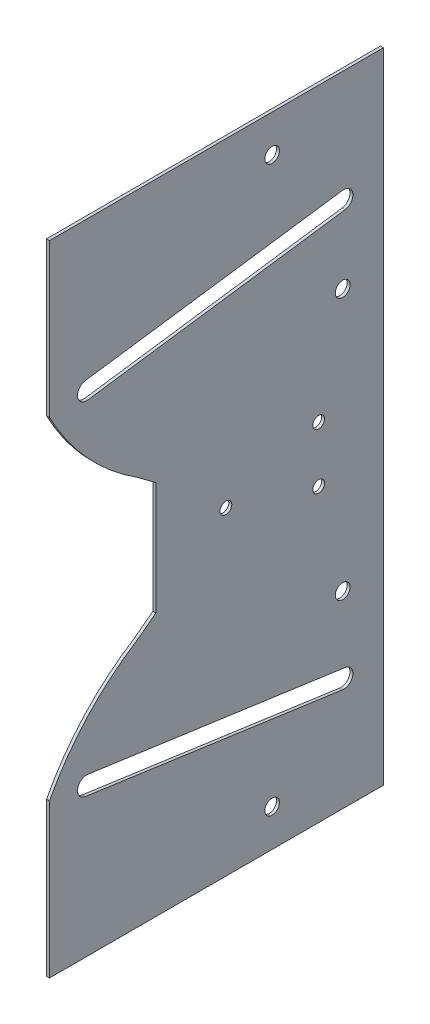
ISO-10303-21;
HEADER;
FILE_DESCRIPTION(('STEP AP214'),'2;1');
FILE_NAME('part.step','',(''),(''),'','','');
FILE_SCHEMA(('AUTOMOTIVE_DESIGN { 1 0 10303 214 1 1 1 1 }'));
ENDSEC;
DATA;
#1=APPLICATION_CONTEXT('core data for automotive mechanical design processes');
#2=APPLICATION_PROTOCOL_DEFINITION('international standard','automotive_design',2000,#1);
#3=PRODUCT_CONTEXT('',#1,'mechanical');
#4=PRODUCT('Part','Part','',(#3));
#5=PRODUCT_RELATED_PRODUCT_CATEGORY('part','',(#4));
#6=PRODUCT_DEFINITION_FORMATION('','',#4);
#7=PRODUCT_DEFINITION_CONTEXT('part definition',#1,'design');
#8=PRODUCT_DEFINITION('design','',#6,#7);
#9=PRODUCT_DEFINITION_SHAPE('','',#8);
#10=(LENGTH_UNIT() NAMED_UNIT(*) SI_UNIT(.MILLI.,.METRE.));
#11=(NAMED_UNIT(*) PLANE_ANGLE_UNIT() SI_UNIT($,.RADIAN.));
#12=(NAMED_UNIT(*) SI_UNIT($,.STERADIAN.) SOLID_ANGLE_UNIT());
#13=UNCERTAINTY_MEASURE_WITH_UNIT(LENGTH_MEASURE(1.E-05),#10,'distance_accuracy_value','');
#14=(GEOMETRIC_REPRESENTATION_CONTEXT(3) GLOBAL_UNCERTAINTY_ASSIGNED_CONTEXT((#13)) GLOBAL_UNIT_ASSIGNED_CONTEXT((#10,
#11,#12)) REPRESENTATION_CONTEXT('',''));
#15=CARTESIAN_POINT('',(0.,0.,0.));
#16=DIRECTION('',(0.,0.,1.));
#17=DIRECTION('',(1.,0.,0.));
#18=AXIS2_PLACEMENT_3D('',#15,#16,#17);
#19=CARTESIAN_POINT('',(18.,0.,45.));
#20=DIRECTION('',(1.,0.,0.));
#21=DIRECTION('',(0.,1.,0.));
#22=AXIS2_PLACEMENT_3D('',#19,#20,#21);
#23=PLANE('',#22);
#24=CARTESIAN_POINT('',(18.,15.9693802193929,-2.53660000119266));
#25=DIRECTION('',(1.,0.,0.));
#26=DIRECTION('',(0.,1.,0.));
#27=AXIS2_PLACEMENT_3D('',#24,#25,#26);
#28=CIRCLE('',#27,1.5875);
#29=CARTESIAN_POINT('',(18.,17.5568802193929,-2.53660000119266));
#30=VERTEX_POINT('',#29);
#31=EDGE_CURVE('E321',#30,#30,#28,.T.);
#32=ORIENTED_EDGE('',*,*,#31,.F.);
#33=EDGE_LOOP('',(#32));
#34=FACE_BOUND('',#33,.T.);
#35=CARTESIAN_POINT('',(18.,23.4693802193929,-27.5366000011927));
#36=DIRECTION('',(1.,0.,0.));
#37=DIRECTION('',(0.,1.,0.));
#38=AXIS2_PLACEMENT_3D('',#35,#36,#37);
#39=CIRCLE('',#38,1.5875);
#40=CARTESIAN_POINT('',(18.,25.0568802193929,-27.5366000011927));
#41=VERTEX_POINT('',#40);
#42=EDGE_CURVE('E326',#41,#41,#39,.T.);
#43=ORIENTED_EDGE('',*,*,#42,.F.);
#44=EDGE_LOOP('',(#43));
#45=FACE_BOUND('',#44,.T.);
#46=CARTESIAN_POINT('',(18.,8.46938021939293,-27.5366000011927));
#47=DIRECTION('',(1.,0.,0.));
#48=DIRECTION('',(0.,1.,0.));
#49=AXIS2_PLACEMENT_3D('',#46,#47,#48);
#50=CIRCLE('',#49,1.58749999999998);
#51=CARTESIAN_POINT('',(18.,10.0568802193929,-27.5366000011927));
#52=VERTEX_POINT('',#51);
#53=EDGE_CURVE('E330',#52,#52,#50,.T.);
#54=ORIENTED_EDGE('',*,*,#53,.F.);
#55=EDGE_LOOP('',(#54));
#56=FACE_BOUND('',#55,.T.);
#57=DIRECTION('',(0.,-1.,0.));
#58=VECTOR('',#57,1.);
#59=CARTESIAN_POINT('',(18.,34.0693802193929,-45.));
#60=LINE('',#59,#58);
#61=CARTESIAN_POINT('',(18.,102.138760438786,-45.));
#62=VERTEX_POINT('',#61);
#63=CARTESIAN_POINT('',(18.,-70.,-45.));
#64=VERTEX_POINT('',#63);
#65=EDGE_CURVE('E336',#62,#64,#60,.T.);
#66=ORIENTED_EDGE('',*,*,#65,.F.);
#67=DIRECTION('',(0.,0.,-1.));
#68=VECTOR('',#67,1.);
#69=CARTESIAN_POINT('',(18.,102.138760438786,45.));
#70=LINE('',#69,#68);
#71=CARTESIAN_POINT('',(18.,102.138760438786,45.));
#72=VERTEX_POINT('',#71);
#73=EDGE_CURVE('E239',#72,#62,#70,.T.);
#74=ORIENTED_EDGE('',*,*,#73,.F.);
#75=DIRECTION('',(0.,-1.,0.));
#76=VECTOR('',#75,1.);
#77=CARTESIAN_POINT('',(18.,102.138760438786,45.));
#78=LINE('',#77,#76);
#79=CARTESIAN_POINT('',(18.,60.8083015169953,45.));
#80=VERTEX_POINT('',#79);
#81=EDGE_CURVE('E276',#72,#80,#78,.T.);
#82=ORIENTED_EDGE('',*,*,#81,.T.);
#83=CARTESIAN_POINT('',(18.,92.1387604387858,-15.));
#84=DIRECTION('',(1.,0.,0.));
#85=DIRECTION('',(0.,1.,0.));
#86=AXIS2_PLACEMENT_3D('',#83,#84,#85);
#87=CIRCLE('',#86,67.6875);
#88=CARTESIAN_POINT('',(18.,34.9387604387858,21.1905741354016));
#89=VERTEX_POINT('',#88);
#90=EDGE_CURVE('E244',#89,#80,#87,.F.);
#91=ORIENTED_EDGE('',*,*,#90,.F.);
#92=DIRECTION('',(0.,-0.602550092658536,-0.798081064702822));
#93=VECTOR('',#92,1.);
#94=CARTESIAN_POINT('',(18.,34.9387604387858,21.1905741354016));
#95=LINE('',#94,#93);
#96=CARTESIAN_POINT('',(18.,31.2693802193929,16.3304589217904));
#97=VERTEX_POINT('',#96);
#98=EDGE_CURVE('E319',#89,#97,#95,.T.);
#99=ORIENTED_EDGE('',*,*,#98,.T.);
#100=DIRECTION('',(0.,-1.,0.));
#101=VECTOR('',#100,1.);
#102=CARTESIAN_POINT('',(18.,34.0693802193929,16.3304589217905));
#103=LINE('',#102,#101);
#104=CARTESIAN_POINT('',(18.,0.86938021939288,16.3304589217904));
#105=VERTEX_POINT('',#104);
#106=EDGE_CURVE('E337',#105,#97,#103,.F.);
#107=ORIENTED_EDGE('',*,*,#106,.F.);
#108=DIRECTION('',(0.,-0.602550092658533,0.798081064702824));
#109=VECTOR('',#108,1.);
#110=CARTESIAN_POINT('',(18.,0.869380219392879,16.3304589217904));
#111=LINE('',#110,#109);
#112=CARTESIAN_POINT('',(18.,-2.79999999999999,21.1905741354016));
#113=VERTEX_POINT('',#112);
#114=EDGE_CURVE('E197',#105,#113,#111,.T.);
#115=ORIENTED_EDGE('',*,*,#114,.T.);
#116=CARTESIAN_POINT('',(18.,-60.,-15.));
#117=DIRECTION('',(-1.,0.,0.));
#118=DIRECTION('',(0.,1.,0.));
#119=AXIS2_PLACEMENT_3D('',#116,#117,#118);
#120=CIRCLE('',#119,67.6875);
#121=CARTESIAN_POINT('',(18.,-28.6695410782095,45.));
#122=VERTEX_POINT('',#121);
#123=EDGE_CURVE('E181',#122,#113,#120,.T.);
#124=ORIENTED_EDGE('',*,*,#123,.F.);
#125=DIRECTION('',(0.,-1.,0.));
#126=VECTOR('',#125,1.);
#127=CARTESIAN_POINT('',(18.,0.,45.));
#128=LINE('',#127,#126);
#129=CARTESIAN_POINT('',(18.,-70.,45.));
#130=VERTEX_POINT('',#129);
#131=EDGE_CURVE('E194',#122,#130,#128,.T.);
#132=ORIENTED_EDGE('',*,*,#131,.T.);
#133=DIRECTION('',(0.,0.,-1.));
#134=VECTOR('',#133,1.);
#135=CARTESIAN_POINT('',(18.,-70.,45.));
#136=LINE('',#135,#134);
#137=EDGE_CURVE('E199',#130,#64,#136,.T.);
#138=ORIENTED_EDGE('',*,*,#137,.T.);
#139=EDGE_LOOP('',(#66,#74,#82,#91,#99,#107,#115,#124,#132,#138));
#140=FACE_BOUND('',#139,.T.);
#141=CARTESIAN_POINT('',(18.,92.1387604387858,-15.));
#142=DIRECTION('',(-1.,0.,0.));
#143=DIRECTION('',(0.,0.,-1.));
#144=AXIS2_PLACEMENT_3D('',#141,#142,#143);
#145=CIRCLE('',#144,1.98437499999999);
#146=CARTESIAN_POINT('',(18.,92.1387604387858,-16.984375));
#147=VERTEX_POINT('',#146);
#148=EDGE_CURVE('E294',#147,#147,#145,.T.);
#149=ORIENTED_EDGE('',*,*,#148,.T.);
#150=EDGE_LOOP('',(#149));
#151=FACE_BOUND('',#150,.T.);
#152=CARTESIAN_POINT('',(18.,62.1886328074936,35.));
#153=DIRECTION('',(-1.,0.,0.));
#154=DIRECTION('',(0.,0.,-1.));
#155=AXIS2_PLACEMENT_3D('',#152,#153,#154);
#156=CIRCLE('',#155,2.44999999999999);
#157=CARTESIAN_POINT('',(18.,59.7624760390767,34.6590259026478));
#158=VERTEX_POINT('',#157);
#159=CARTESIAN_POINT('',(18.,64.6147895759104,35.3409740973522));
#160=VERTEX_POINT('',#159);
#161=EDGE_CURVE('E291',#158,#160,#156,.T.);
#162=ORIENTED_EDGE('',*,*,#161,.T.);
#163=DIRECTION('',(0.,0.139173100960066,-0.99026806874157));
#164=VECTOR('',#163,1.);
#165=CARTESIAN_POINT('',(18.,64.6147895759104,35.3409740973522));
#166=LINE('',#165,#164);
#167=CARTESIAN_POINT('',(18.,74.356906643115,-33.9777907145578));
#168=VERTEX_POINT('',#167);
#169=EDGE_CURVE('E288',#160,#168,#166,.T.);
#170=ORIENTED_EDGE('',*,*,#169,.T.);
#171=CARTESIAN_POINT('',(18.,71.9307498746982,-34.3187648119099));
#172=DIRECTION('',(-1.,0.,0.));
#173=DIRECTION('',(0.,0.,-1.));
#174=AXIS2_PLACEMENT_3D('',#171,#172,#173);
#175=CIRCLE('',#174,2.45);
#176=CARTESIAN_POINT('',(18.,69.5045931062813,-34.6597389092621));
#177=VERTEX_POINT('',#176);
#178=EDGE_CURVE('E285',#168,#177,#175,.T.);
#179=ORIENTED_EDGE('',*,*,#178,.T.);
#180=DIRECTION('',(0.,-0.139173100960066,0.99026806874157));
#181=VECTOR('',#180,1.);
#182=CARTESIAN_POINT('',(18.,59.7624760390767,34.6590259026478));
#183=LINE('',#182,#181);
#184=EDGE_CURVE('E282',#177,#158,#183,.T.);
#185=ORIENTED_EDGE('',*,*,#184,.T.);
#186=EDGE_LOOP('',(#162,#170,#179,#185));
#187=FACE_BOUND('',#186,.T.);
#188=CARTESIAN_POINT('',(18.,51.3549100221364,-34.0178217783312));
#189=DIRECTION('',(-1.,0.,0.));
#190=DIRECTION('',(0.,-1.,0.));
#191=AXIS2_PLACEMENT_3D('',#188,#189,#190);
#192=CIRCLE('',#191,1.99999999999998);
#193=CARTESIAN_POINT('',(18.,49.3549100221364,-34.0178217783312));
#194=VERTEX_POINT('',#193);
#195=EDGE_CURVE('E279',#194,#194,#192,.T.);
#196=ORIENTED_EDGE('',*,*,#195,.T.);
#197=EDGE_LOOP('',(#196));
#198=FACE_BOUND('',#197,.T.);
#199=CARTESIAN_POINT('',(18.,-60.,-15.));
#200=DIRECTION('',(1.,0.,0.));
#201=DIRECTION('',(0.,0.,-1.));
#202=AXIS2_PLACEMENT_3D('',#199,#200,#201);
#203=CIRCLE('',#202,1.98437499999999);
#204=CARTESIAN_POINT('',(18.,-60.,-16.984375));
#205=VERTEX_POINT('',#204);
#206=EDGE_CURVE('E204',#205,#205,#203,.T.);
#207=ORIENTED_EDGE('',*,*,#206,.F.);
#208=EDGE_LOOP('',(#207));
#209=FACE_BOUND('',#208,.T.);
#210=CARTESIAN_POINT('',(18.,-30.0498723687078,35.));
#211=DIRECTION('',(1.,0.,0.));
#212=DIRECTION('',(0.,0.,-1.));
#213=AXIS2_PLACEMENT_3D('',#210,#211,#212);
#214=CIRCLE('',#213,2.44999999999999);
#215=CARTESIAN_POINT('',(18.,-27.623715600291,34.6590259026478));
#216=VERTEX_POINT('',#215);
#217=CARTESIAN_POINT('',(18.,-32.4760291371246,35.3409740973522));
#218=VERTEX_POINT('',#217);
#219=EDGE_CURVE('E208',#216,#218,#214,.T.);
#220=ORIENTED_EDGE('',*,*,#219,.F.);
#221=DIRECTION('',(0.,0.139173100960066,0.99026806874157));
#222=VECTOR('',#221,1.);
#223=CARTESIAN_POINT('',(18.,-27.623715600291,34.6590259026478));
#224=LINE('',#223,#222);
#225=CARTESIAN_POINT('',(18.,-37.3658326674956,-34.6597389092621));
#226=VERTEX_POINT('',#225);
#227=EDGE_CURVE('E214',#226,#216,#224,.T.);
#228=ORIENTED_EDGE('',*,*,#227,.F.);
#229=CARTESIAN_POINT('',(18.,-39.7919894359124,-34.3187648119099));
#230=DIRECTION('',(1.,0.,0.));
#231=DIRECTION('',(0.,0.,-1.));
#232=AXIS2_PLACEMENT_3D('',#229,#230,#231);
#233=CIRCLE('',#232,2.45);
#234=CARTESIAN_POINT('',(18.,-42.2181462043292,-33.9777907145578));
#235=VERTEX_POINT('',#234);
#236=EDGE_CURVE('E219',#235,#226,#233,.T.);
#237=ORIENTED_EDGE('',*,*,#236,.F.);
#238=DIRECTION('',(0.,-0.139173100960066,-0.99026806874157));
#239=VECTOR('',#238,1.);
#240=CARTESIAN_POINT('',(18.,-32.4760291371246,35.3409740973522));
#241=LINE('',#240,#239);
#242=EDGE_CURVE('E224',#218,#235,#241,.T.);
#243=ORIENTED_EDGE('',*,*,#242,.F.);
#244=EDGE_LOOP('',(#220,#228,#237,#243));
#245=FACE_BOUND('',#244,.T.);
#246=CARTESIAN_POINT('',(18.,-19.2161495833506,-34.0178217783312));
#247=DIRECTION('',(1.,0.,0.));
#248=DIRECTION('',(0.,1.,0.));
#249=AXIS2_PLACEMENT_3D('',#246,#247,#248);
#250=CIRCLE('',#249,1.99999999999998);
#251=CARTESIAN_POINT('',(18.,-17.2161495833506,-34.0178217783312));
#252=VERTEX_POINT('',#251);
#253=EDGE_CURVE('E230',#252,#252,#250,.T.);
#254=ORIENTED_EDGE('',*,*,#253,.F.);
#255=EDGE_LOOP('',(#254));
#256=FACE_BOUND('',#255,.T.);
#257=ADVANCED_FACE('F55',(#34,#45,#56,#140,#151,#187,#198,#209,#245,#256),#23,.T.);
#258=CARTESIAN_POINT('',(17.2,34.0693802193929,45.));
#259=DIRECTION('',(1.,0.,0.));
#260=DIRECTION('',(0.,1.,0.));
#261=AXIS2_PLACEMENT_3D('',#258,#259,#260);
#262=PLANE('',#261);
#263=CARTESIAN_POINT('',(17.2,15.9693802193929,-2.53660000119266));
#264=DIRECTION('',(1.,0.,0.));
#265=DIRECTION('',(0.,1.,0.));
#266=AXIS2_PLACEMENT_3D('',#263,#264,#265);
#267=CIRCLE('',#266,1.5875);
#268=CARTESIAN_POINT('',(17.2,17.5568802193929,-2.53660000119266));
#269=VERTEX_POINT('',#268);
#270=EDGE_CURVE('E325',#269,#269,#267,.T.);
#271=ORIENTED_EDGE('',*,*,#270,.T.);
#272=EDGE_LOOP('',(#271));
#273=FACE_BOUND('',#272,.T.);
#274=CARTESIAN_POINT('',(17.2,23.4693802193929,-27.5366000011927));
#275=DIRECTION('',(1.,0.,0.));
#276=DIRECTION('',(0.,1.,0.));
#277=AXIS2_PLACEMENT_3D('',#274,#275,#276);
#278=CIRCLE('',#277,1.5875);
#279=CARTESIAN_POINT('',(17.2,25.0568802193929,-27.5366000011927));
#280=VERTEX_POINT('',#279);
#281=EDGE_CURVE('E329',#280,#280,#278,.T.);
#282=ORIENTED_EDGE('',*,*,#281,.T.);
#283=EDGE_LOOP('',(#282));
#284=FACE_BOUND('',#283,.T.);
#285=CARTESIAN_POINT('',(17.2,8.46938021939293,-27.5366000011927));
#286=DIRECTION('',(1.,0.,0.));
#287=DIRECTION('',(0.,1.,0.));
#288=AXIS2_PLACEMENT_3D('',#285,#286,#287);
#289=CIRCLE('',#288,1.58749999999998);
#290=CARTESIAN_POINT('',(17.2,10.0568802193929,-27.5366000011927));
#291=VERTEX_POINT('',#290);
#292=EDGE_CURVE('E333',#291,#291,#289,.T.);
#293=ORIENTED_EDGE('',*,*,#292,.T.);
#294=EDGE_LOOP('',(#293));
#295=FACE_BOUND('',#294,.T.);
#296=DIRECTION('',(0.,1.,0.));
#297=VECTOR('',#296,1.);
#298=CARTESIAN_POINT('',(17.2,34.0693802193929,16.3304589217905));
#299=LINE('',#298,#297);
#300=CARTESIAN_POINT('',(17.2,0.86938021939288,16.3304589217904));
#301=VERTEX_POINT('',#300);
#302=CARTESIAN_POINT('',(17.2,31.2693802193929,16.3304589217905));
#303=VERTEX_POINT('',#302);
#304=EDGE_CURVE('E334',#301,#303,#299,.T.);
#305=ORIENTED_EDGE('',*,*,#304,.T.);
#306=DIRECTION('',(0.,-0.602550092658536,-0.798081064702822));
#307=VECTOR('',#306,1.);
#308=CARTESIAN_POINT('',(17.2,34.9387604387858,21.1905741354016));
#309=LINE('',#308,#307);
#310=CARTESIAN_POINT('',(17.2,34.9387604387858,21.1905741354016));
#311=VERTEX_POINT('',#310);
#312=EDGE_CURVE('E69',#311,#303,#309,.T.);
#313=ORIENTED_EDGE('',*,*,#312,.F.);
#314=CARTESIAN_POINT('',(17.2,92.1387604387858,-15.));
#315=DIRECTION('',(1.,0.,0.));
#316=DIRECTION('',(0.,1.,0.));
#317=AXIS2_PLACEMENT_3D('',#314,#315,#316);
#318=CIRCLE('',#317,67.6875);
#319=CARTESIAN_POINT('',(17.2,60.8083015169953,45.));
#320=VERTEX_POINT('',#319);
#321=EDGE_CURVE('E252',#311,#320,#318,.F.);
#322=ORIENTED_EDGE('',*,*,#321,.T.);
#323=DIRECTION('',(0.,-1.,0.));
#324=VECTOR('',#323,1.);
#325=CARTESIAN_POINT('',(17.2,102.138760438786,45.));
#326=LINE('',#325,#324);
#327=CARTESIAN_POINT('',(17.2,102.138760438786,45.));
#328=VERTEX_POINT('',#327);
#329=EDGE_CURVE('E311',#328,#320,#326,.T.);
#330=ORIENTED_EDGE('',*,*,#329,.F.);
#331=DIRECTION('',(0.,0.,-1.));
#332=VECTOR('',#331,1.);
#333=CARTESIAN_POINT('',(17.2,102.138760438786,45.));
#334=LINE('',#333,#332);
#335=CARTESIAN_POINT('',(17.2,102.138760438786,-45.));
#336=VERTEX_POINT('',#335);
#337=EDGE_CURVE('E249',#328,#336,#334,.T.);
#338=ORIENTED_EDGE('',*,*,#337,.T.);
#339=DIRECTION('',(0.,-1.,0.));
#340=VECTOR('',#339,1.);
#341=CARTESIAN_POINT('',(17.2,34.0693802193929,-45.));
#342=LINE('',#341,#340);
#343=CARTESIAN_POINT('',(17.2,-70.,-45.));
#344=VERTEX_POINT('',#343);
#345=EDGE_CURVE('E341',#336,#344,#342,.T.);
#346=ORIENTED_EDGE('',*,*,#345,.T.);
#347=DIRECTION('',(0.,0.,-1.));
#348=VECTOR('',#347,1.);
#349=CARTESIAN_POINT('',(17.2,-70.,45.));
#350=LINE('',#349,#348);
#351=CARTESIAN_POINT('',(17.2,-70.,45.));
#352=VERTEX_POINT('',#351);
#353=EDGE_CURVE('E235',#352,#344,#350,.T.);
#354=ORIENTED_EDGE('',*,*,#353,.F.);
#355=DIRECTION('',(0.,-1.,0.));
#356=VECTOR('',#355,1.);
#357=CARTESIAN_POINT('',(17.2,0.,45.));
#358=LINE('',#357,#356);
#359=CARTESIAN_POINT('',(17.2,-28.6695410782095,45.));
#360=VERTEX_POINT('',#359);
#361=EDGE_CURVE('E187',#360,#352,#358,.T.);
#362=ORIENTED_EDGE('',*,*,#361,.F.);
#363=CARTESIAN_POINT('',(17.2,-60.,-15.));
#364=DIRECTION('',(-1.,0.,0.));
#365=DIRECTION('',(0.,-1.,0.));
#366=AXIS2_PLACEMENT_3D('',#363,#364,#365);
#367=CIRCLE('',#366,67.6875);
#368=CARTESIAN_POINT('',(17.2,-2.80000000000001,21.1905741354016));
#369=VERTEX_POINT('',#368);
#370=EDGE_CURVE('E183',#360,#369,#367,.T.);
#371=ORIENTED_EDGE('',*,*,#370,.T.);
#372=DIRECTION('',(0.,-0.602550092658533,0.798081064702824));
#373=VECTOR('',#372,1.);
#374=CARTESIAN_POINT('',(17.2,0.869380219392879,16.3304589217904));
#375=LINE('',#374,#373);
#376=EDGE_CURVE('E240',#301,#369,#375,.T.);
#377=ORIENTED_EDGE('',*,*,#376,.F.);
#378=EDGE_LOOP('',(#305,#313,#322,#330,#338,#346,#354,#362,#371,#377));
#379=FACE_BOUND('',#378,.T.);
#380=CARTESIAN_POINT('',(17.2,92.1387604387858,-15.));
#381=DIRECTION('',(1.,0.,0.));
#382=DIRECTION('',(0.,1.,0.));
#383=AXIS2_PLACEMENT_3D('',#380,#381,#382);
#384=CIRCLE('',#383,1.98437499999999);
#385=CARTESIAN_POINT('',(17.2,94.1231354387858,-15.));
#386=VERTEX_POINT('',#385);
#387=EDGE_CURVE('E270',#386,#386,#384,.T.);
#388=ORIENTED_EDGE('',*,*,#387,.T.);
#389=EDGE_LOOP('',(#388));
#390=FACE_BOUND('',#389,.T.);
#391=DIRECTION('',(0.,-0.139173100960066,0.99026806874157));
#392=VECTOR('',#391,1.);
#393=CARTESIAN_POINT('',(17.2,64.0104028925674,39.6414088046232));
#394=LINE('',#393,#392);
#395=CARTESIAN_POINT('',(17.2,74.356906643115,-33.9777907145578));
#396=VERTEX_POINT('',#395);
#397=CARTESIAN_POINT('',(17.2,64.6147895759104,35.3409740973522));
#398=VERTEX_POINT('',#397);
#399=EDGE_CURVE('E267',#396,#398,#394,.T.);
#400=ORIENTED_EDGE('',*,*,#399,.T.);
#401=CARTESIAN_POINT('',(17.2,62.1886328074936,35.));
#402=DIRECTION('',(1.,0.,0.));
#403=DIRECTION('',(0.,1.,0.));
#404=AXIS2_PLACEMENT_3D('',#401,#402,#403);
#405=CIRCLE('',#404,2.44999999999999);
#406=CARTESIAN_POINT('',(17.2,59.7624760390767,34.6590259026478));
#407=VERTEX_POINT('',#406);
#408=EDGE_CURVE('E264',#398,#407,#405,.T.);
#409=ORIENTED_EDGE('',*,*,#408,.T.);
#410=DIRECTION('',(0.,0.139173100960066,-0.99026806874157));
#411=VECTOR('',#410,1.);
#412=CARTESIAN_POINT('',(17.2,59.1580893557337,38.9594606099189));
#413=LINE('',#412,#411);
#414=CARTESIAN_POINT('',(17.2,69.5045931062813,-34.6597389092621));
#415=VERTEX_POINT('',#414);
#416=EDGE_CURVE('E261',#407,#415,#413,.T.);
#417=ORIENTED_EDGE('',*,*,#416,.T.);
#418=CARTESIAN_POINT('',(17.2,71.9307498746982,-34.3187648119099));
#419=DIRECTION('',(1.,0.,0.));
#420=DIRECTION('',(0.,1.,0.));
#421=AXIS2_PLACEMENT_3D('',#418,#419,#420);
#422=CIRCLE('',#421,2.45);
#423=EDGE_CURVE('E258',#415,#396,#422,.T.);
#424=ORIENTED_EDGE('',*,*,#423,.T.);
#425=EDGE_LOOP('',(#400,#409,#417,#424));
#426=FACE_BOUND('',#425,.T.);
#427=CARTESIAN_POINT('',(17.2,51.3549100221364,-34.0178217783312));
#428=DIRECTION('',(1.,0.,0.));
#429=DIRECTION('',(0.,1.,0.));
#430=AXIS2_PLACEMENT_3D('',#427,#428,#429);
#431=CIRCLE('',#430,1.99999999999998);
#432=CARTESIAN_POINT('',(17.2,53.3549100221364,-34.0178217783312));
#433=VERTEX_POINT('',#432);
#434=EDGE_CURVE('E255',#433,#433,#431,.T.);
#435=ORIENTED_EDGE('',*,*,#434,.T.);
#436=EDGE_LOOP('',(#435));
#437=FACE_BOUND('',#436,.T.);
#438=CARTESIAN_POINT('',(17.2,-60.,-15.));
#439=DIRECTION('',(1.,0.,0.));
#440=DIRECTION('',(0.,1.,0.));
#441=AXIS2_PLACEMENT_3D('',#438,#439,#440);
#442=CIRCLE('',#441,1.98437499999999);
#443=CARTESIAN_POINT('',(17.2,-58.015625,-15.));
#444=VERTEX_POINT('',#443);
#445=EDGE_CURVE('E361',#444,#444,#442,.T.);
#446=ORIENTED_EDGE('',*,*,#445,.T.);
#447=EDGE_LOOP('',(#446));
#448=FACE_BOUND('',#447,.T.);
#449=DIRECTION('',(0.,0.139173100960066,0.99026806874157));
#450=VECTOR('',#449,1.);
#451=CARTESIAN_POINT('',(17.2,-25.6634882747891,48.6067680635139));
#452=LINE('',#451,#450);
#453=CARTESIAN_POINT('',(17.2,-37.3658326674956,-34.6597389092621));
#454=VERTEX_POINT('',#453);
#455=CARTESIAN_POINT('',(17.2,-27.623715600291,34.6590259026478));
#456=VERTEX_POINT('',#455);
#457=EDGE_CURVE('E364',#454,#456,#452,.T.);
#458=ORIENTED_EDGE('',*,*,#457,.T.);
#459=CARTESIAN_POINT('',(17.2,-30.0498723687078,35.));
#460=DIRECTION('',(1.,0.,0.));
#461=DIRECTION('',(0.,1.,0.));
#462=AXIS2_PLACEMENT_3D('',#459,#460,#461);
#463=CIRCLE('',#462,2.44999999999999);
#464=CARTESIAN_POINT('',(17.2,-32.4760291371246,35.3409740973522));
#465=VERTEX_POINT('',#464);
#466=EDGE_CURVE('E369',#456,#465,#463,.T.);
#467=ORIENTED_EDGE('',*,*,#466,.T.);
#468=DIRECTION('',(0.,-0.139173100960066,-0.99026806874157));
#469=VECTOR('',#468,1.);
#470=CARTESIAN_POINT('',(17.2,-30.5158018116228,49.2887162582182));
#471=LINE('',#470,#469);
#472=CARTESIAN_POINT('',(17.2,-42.2181462043292,-33.9777907145578));
#473=VERTEX_POINT('',#472);
#474=EDGE_CURVE('E372',#465,#473,#471,.T.);
#475=ORIENTED_EDGE('',*,*,#474,.T.);
#476=CARTESIAN_POINT('',(17.2,-39.7919894359124,-34.3187648119099));
#477=DIRECTION('',(1.,0.,0.));
#478=DIRECTION('',(0.,1.,0.));
#479=AXIS2_PLACEMENT_3D('',#476,#477,#478);
#480=CIRCLE('',#479,2.45);
#481=EDGE_CURVE('E375',#473,#454,#480,.T.);
#482=ORIENTED_EDGE('',*,*,#481,.T.);
#483=EDGE_LOOP('',(#458,#467,#475,#482));
#484=FACE_BOUND('',#483,.T.);
#485=CARTESIAN_POINT('',(17.2,-19.2161495833506,-34.0178217783312));
#486=DIRECTION('',(1.,0.,0.));
#487=DIRECTION('',(0.,1.,0.));
#488=AXIS2_PLACEMENT_3D('',#485,#486,#487);
#489=CIRCLE('',#488,1.99999999999998);
#490=CARTESIAN_POINT('',(17.2,-17.2161495833506,-34.0178217783312));
#491=VERTEX_POINT('',#490);
#492=EDGE_CURVE('E378',#491,#491,#489,.T.);
#493=ORIENTED_EDGE('',*,*,#492,.T.);
#494=EDGE_LOOP('',(#493));
#495=FACE_BOUND('',#494,.T.);
#496=ADVANCED_FACE('F355',(#273,#284,#295,#379,#390,#426,#437,#448,#484,#495),#262,.F.);
#497=CARTESIAN_POINT('',(15.2,-1.13061978060712,-45.));
#498=DIRECTION('',(0.,0.,-1.));
#499=DIRECTION('',(0.,1.,0.));
#500=AXIS2_PLACEMENT_3D('',#497,#498,#499);
#501=PLANE('',#500);
#502=ORIENTED_EDGE('',*,*,#65,.T.);
#503=DIRECTION('',(-1.,0.,0.));
#504=VECTOR('',#503,1.);
#505=CARTESIAN_POINT('',(18.,-70.,-45.));
#506=LINE('',#505,#504);
#507=EDGE_CURVE('E243',#64,#344,#506,.T.);
#508=ORIENTED_EDGE('',*,*,#507,.T.);
#509=ORIENTED_EDGE('',*,*,#345,.F.);
#510=DIRECTION('',(1.,0.,0.));
#511=VECTOR('',#510,1.);
#512=CARTESIAN_POINT('',(17.2,102.138760438786,-45.));
#513=LINE('',#512,#511);
#514=EDGE_CURVE('E273',#336,#62,#513,.T.);
#515=ORIENTED_EDGE('',*,*,#514,.T.);
#516=EDGE_LOOP('',(#502,#508,#509,#515));
#517=FACE_BOUND('',#516,.T.);
#518=ADVANCED_FACE('F385',(#517),#501,.T.);
#519=CARTESIAN_POINT('',(18.,34.0693802193929,16.3304589217905));
#520=DIRECTION('',(0.,0.,1.));
#521=DIRECTION('',(0.,-1.,0.));
#522=AXIS2_PLACEMENT_3D('',#519,#520,#521);
#523=PLANE('',#522);
#524=ORIENTED_EDGE('',*,*,#106,.T.);
#525=DIRECTION('',(-1.,0.,0.));
#526=VECTOR('',#525,1.);
#527=CARTESIAN_POINT('',(18.,31.2693802193929,16.3304589217904));
#528=LINE('',#527,#526);
#529=EDGE_CURVE('E62',#97,#303,#528,.T.);
#530=ORIENTED_EDGE('',*,*,#529,.T.);
#531=ORIENTED_EDGE('',*,*,#304,.F.);
#532=DIRECTION('',(-1.,0.,0.));
#533=VECTOR('',#532,1.);
#534=CARTESIAN_POINT('',(18.,0.869380219392882,16.3304589217905));
#535=LINE('',#534,#533);
#536=EDGE_CURVE('E14',#105,#301,#535,.T.);
#537=ORIENTED_EDGE('',*,*,#536,.F.);
#538=EDGE_LOOP('',(#524,#530,#531,#537));
#539=FACE_BOUND('',#538,.T.);
#540=ADVANCED_FACE('F350',(#539),#523,.T.);
#541=CARTESIAN_POINT('',(8.00000000000001,8.46938021939293,-27.5366000011927));
#542=DIRECTION('',(1.,0.,0.));
#543=DIRECTION('',(0.,1.,0.));
#544=AXIS2_PLACEMENT_3D('',#541,#542,#543);
#545=CYLINDRICAL_SURFACE('',#544,1.58749999999998);
#546=ORIENTED_EDGE('',*,*,#53,.T.);
#547=EDGE_LOOP('',(#546));
#548=FACE_BOUND('',#547,.T.);
#549=ORIENTED_EDGE('',*,*,#292,.F.);
#550=EDGE_LOOP('',(#549));
#551=FACE_BOUND('',#550,.T.);
#552=ADVANCED_FACE('F424',(#548,#551),#545,.F.);
#553=CARTESIAN_POINT('',(8.00000000000001,23.4693802193929,-27.5366000011927));
#554=DIRECTION('',(1.,0.,0.));
#555=DIRECTION('',(0.,1.,0.));
#556=AXIS2_PLACEMENT_3D('',#553,#554,#555);
#557=CYLINDRICAL_SURFACE('',#556,1.5875);
#558=ORIENTED_EDGE('',*,*,#42,.T.);
#559=EDGE_LOOP('',(#558));
#560=FACE_BOUND('',#559,.T.);
#561=ORIENTED_EDGE('',*,*,#281,.F.);
#562=EDGE_LOOP('',(#561));
#563=FACE_BOUND('',#562,.T.);
#564=ADVANCED_FACE('F427',(#560,#563),#557,.F.);
#565=CARTESIAN_POINT('',(8.00000000000001,15.9693802193929,-2.53660000119266));
#566=DIRECTION('',(1.,0.,0.));
#567=DIRECTION('',(0.,1.,0.));
#568=AXIS2_PLACEMENT_3D('',#565,#566,#567);
#569=CYLINDRICAL_SURFACE('',#568,1.5875);
#570=ORIENTED_EDGE('',*,*,#31,.T.);
#571=EDGE_LOOP('',(#570));
#572=FACE_BOUND('',#571,.T.);
#573=ORIENTED_EDGE('',*,*,#270,.F.);
#574=EDGE_LOOP('',(#573));
#575=FACE_BOUND('',#574,.T.);
#576=ADVANCED_FACE('F435',(#572,#575),#569,.F.);
#577=CARTESIAN_POINT('',(17.664,34.9387604387858,21.1905741354016));
#578=DIRECTION('',(0.,-0.798081064702822,0.602550092658536));
#579=DIRECTION('',(0.,-0.602550092658536,-0.798081064702822));
#580=AXIS2_PLACEMENT_3D('',#577,#578,#579);
#581=PLANE('',#580);
#582=ORIENTED_EDGE('',*,*,#312,.T.);
#583=ORIENTED_EDGE('',*,*,#529,.F.);
#584=ORIENTED_EDGE('',*,*,#98,.F.);
#585=DIRECTION('',(1.,0.,0.));
#586=VECTOR('',#585,1.);
#587=CARTESIAN_POINT('',(17.2,34.9387604387858,21.1905741354016));
#588=LINE('',#587,#586);
#589=EDGE_CURVE('E246',#311,#89,#588,.T.);
#590=ORIENTED_EDGE('',*,*,#589,.F.);
#591=EDGE_LOOP('',(#582,#583,#584,#590));
#592=FACE_BOUND('',#591,.T.);
#593=ADVANCED_FACE('F352',(#592),#581,.T.);
#594=CARTESIAN_POINT('',(17.2,102.138760438786,45.));
#595=DIRECTION('',(0.,1.,0.));
#596=DIRECTION('',(0.,0.,-1.));
#597=AXIS2_PLACEMENT_3D('',#594,#595,#596);
#598=PLANE('',#597);
#599=ORIENTED_EDGE('',*,*,#73,.T.);
#600=ORIENTED_EDGE('',*,*,#514,.F.);
#601=ORIENTED_EDGE('',*,*,#337,.F.);
#602=DIRECTION('',(1.,0.,0.));
#603=VECTOR('',#602,1.);
#604=CARTESIAN_POINT('',(17.2,102.138760438786,45.));
#605=LINE('',#604,#603);
#606=EDGE_CURVE('E314',#328,#72,#605,.T.);
#607=ORIENTED_EDGE('',*,*,#606,.T.);
#608=EDGE_LOOP('',(#599,#600,#601,#607));
#609=FACE_BOUND('',#608,.T.);
#610=ADVANCED_FACE('F392',(#609),#598,.T.);
#611=CARTESIAN_POINT('',(-15.2,34.9387604387857,45.));
#612=DIRECTION('',(0.,0.,1.));
#613=DIRECTION('',(-1.,0.,0.));
#614=AXIS2_PLACEMENT_3D('',#611,#612,#613);
#615=PLANE('',#614);
#616=ORIENTED_EDGE('',*,*,#329,.T.);
#617=DIRECTION('',(-1.,0.,0.));
#618=VECTOR('',#617,1.);
#619=CARTESIAN_POINT('',(17.2,60.8083015169953,45.));
#620=LINE('',#619,#618);
#621=EDGE_CURVE('E308',#320,#80,#620,.F.);
#622=ORIENTED_EDGE('',*,*,#621,.T.);
#623=ORIENTED_EDGE('',*,*,#81,.F.);
#624=ORIENTED_EDGE('',*,*,#606,.F.);
#625=EDGE_LOOP('',(#616,#622,#623,#624));
#626=FACE_BOUND('',#625,.T.);
#627=ADVANCED_FACE('F395',(#626),#615,.T.);
#628=CARTESIAN_POINT('',(18.,51.3549100221364,-34.0178217783312));
#629=DIRECTION('',(-1.,0.,0.));
#630=DIRECTION('',(0.,-1.,0.));
#631=AXIS2_PLACEMENT_3D('',#628,#629,#630);
#632=CYLINDRICAL_SURFACE('',#631,1.99999999999998);
#633=ORIENTED_EDGE('',*,*,#195,.F.);
#634=EDGE_LOOP('',(#633));
#635=FACE_BOUND('',#634,.T.);
#636=ORIENTED_EDGE('',*,*,#434,.F.);
#637=EDGE_LOOP('',(#636));
#638=FACE_BOUND('',#637,.T.);
#639=ADVANCED_FACE('F629',(#635,#638),#632,.F.);
#640=CARTESIAN_POINT('',(18.,59.7624760390767,34.6590259026478));
#641=DIRECTION('',(0.,-0.99026806874157,-0.139173100960066));
#642=DIRECTION('',(0.,-0.139173100960066,0.99026806874157));
#643=AXIS2_PLACEMENT_3D('',#640,#641,#642);
#644=PLANE('',#643);
#645=DIRECTION('',(-1.,0.,0.));
#646=VECTOR('',#645,1.);
#647=CARTESIAN_POINT('',(18.,59.7624760390767,34.6590259026478));
#648=LINE('',#647,#646);
#649=EDGE_CURVE('E297',#158,#407,#648,.T.);
#650=ORIENTED_EDGE('',*,*,#649,.F.);
#651=ORIENTED_EDGE('',*,*,#184,.F.);
#652=DIRECTION('',(-1.,0.,0.));
#653=VECTOR('',#652,1.);
#654=CARTESIAN_POINT('',(18.,69.5045931062813,-34.6597389092621));
#655=LINE('',#654,#653);
#656=EDGE_CURVE('E305',#177,#415,#655,.T.);
#657=ORIENTED_EDGE('',*,*,#656,.T.);
#658=ORIENTED_EDGE('',*,*,#416,.F.);
#659=EDGE_LOOP('',(#650,#651,#657,#658));
#660=FACE_BOUND('',#659,.T.);
#661=ADVANCED_FACE('F639',(#660),#644,.F.);
#662=CARTESIAN_POINT('',(18.,71.9307498746982,-34.3187648119099));
#663=DIRECTION('',(-1.,0.,0.));
#664=DIRECTION('',(0.,0.,-1.));
#665=AXIS2_PLACEMENT_3D('',#662,#663,#664);
#666=CYLINDRICAL_SURFACE('',#665,2.45);
#667=ORIENTED_EDGE('',*,*,#656,.F.);
#668=ORIENTED_EDGE('',*,*,#178,.F.);
#669=DIRECTION('',(-1.,0.,0.));
#670=VECTOR('',#669,1.);
#671=CARTESIAN_POINT('',(18.,74.356906643115,-33.9777907145578));
#672=LINE('',#671,#670);
#673=EDGE_CURVE('E302',#168,#396,#672,.T.);
#674=ORIENTED_EDGE('',*,*,#673,.T.);
#675=ORIENTED_EDGE('',*,*,#423,.F.);
#676=EDGE_LOOP('',(#667,#668,#674,#675));
#677=FACE_BOUND('',#676,.T.);
#678=ADVANCED_FACE('F648',(#677),#666,.F.);
#679=CARTESIAN_POINT('',(18.,64.6147895759104,35.3409740973522));
#680=DIRECTION('',(0.,0.99026806874157,0.139173100960066));
#681=DIRECTION('',(0.,0.139173100960066,-0.99026806874157));
#682=AXIS2_PLACEMENT_3D('',#679,#680,#681);
#683=PLANE('',#682);
#684=ORIENTED_EDGE('',*,*,#673,.F.);
#685=ORIENTED_EDGE('',*,*,#169,.F.);
#686=DIRECTION('',(-1.,0.,0.));
#687=VECTOR('',#686,1.);
#688=CARTESIAN_POINT('',(18.,64.6147895759104,35.3409740973522));
#689=LINE('',#688,#687);
#690=EDGE_CURVE('E300',#160,#398,#689,.T.);
#691=ORIENTED_EDGE('',*,*,#690,.T.);
#692=ORIENTED_EDGE('',*,*,#399,.F.);
#693=EDGE_LOOP('',(#684,#685,#691,#692));
#694=FACE_BOUND('',#693,.T.);
#695=ADVANCED_FACE('F658',(#694),#683,.F.);
#696=CARTESIAN_POINT('',(18.,62.1886328074936,35.));
#697=DIRECTION('',(-1.,0.,0.));
#698=DIRECTION('',(0.,0.,-1.));
#699=AXIS2_PLACEMENT_3D('',#696,#697,#698);
#700=CYLINDRICAL_SURFACE('',#699,2.44999999999999);
#701=ORIENTED_EDGE('',*,*,#690,.F.);
#702=ORIENTED_EDGE('',*,*,#161,.F.);
#703=ORIENTED_EDGE('',*,*,#649,.T.);
#704=ORIENTED_EDGE('',*,*,#408,.F.);
#705=EDGE_LOOP('',(#701,#702,#703,#704));
#706=FACE_BOUND('',#705,.T.);
#707=ADVANCED_FACE('F406',(#706),#700,.F.);
#708=CARTESIAN_POINT('',(18.,92.1387604387858,-15.));
#709=DIRECTION('',(-1.,0.,0.));
#710=DIRECTION('',(0.,0.,-1.));
#711=AXIS2_PLACEMENT_3D('',#708,#709,#710);
#712=CYLINDRICAL_SURFACE('',#711,1.98437499999999);
#713=ORIENTED_EDGE('',*,*,#148,.F.);
#714=EDGE_LOOP('',(#713));
#715=FACE_BOUND('',#714,.T.);
#716=ORIENTED_EDGE('',*,*,#387,.F.);
#717=EDGE_LOOP('',(#716));
#718=FACE_BOUND('',#717,.T.);
#719=ADVANCED_FACE('F398',(#715,#718),#712,.F.);
#720=CARTESIAN_POINT('',(17.2,92.1387604387858,-15.));
#721=DIRECTION('',(1.,0.,0.));
#722=DIRECTION('',(0.,1.,0.));
#723=AXIS2_PLACEMENT_3D('',#720,#721,#722);
#724=CYLINDRICAL_SURFACE('',#723,67.6875);
#725=ORIENTED_EDGE('',*,*,#621,.F.);
#726=ORIENTED_EDGE('',*,*,#321,.F.);
#727=ORIENTED_EDGE('',*,*,#589,.T.);
#728=ORIENTED_EDGE('',*,*,#90,.T.);
#729=EDGE_LOOP('',(#725,#726,#727,#728));
#730=FACE_BOUND('',#729,.T.);
#731=ADVANCED_FACE('F396',(#730),#724,.T.);
#732=CARTESIAN_POINT('',(17.664,0.869380219392879,16.3304589217904));
#733=DIRECTION('',(0.,0.798081064702824,0.602550092658533));
#734=DIRECTION('',(0.,-0.602550092658533,0.798081064702824));
#735=AXIS2_PLACEMENT_3D('',#732,#733,#734);
#736=PLANE('',#735);
#737=ORIENTED_EDGE('',*,*,#376,.T.);
#738=DIRECTION('',(-1.,0.,0.));
#739=VECTOR('',#738,1.);
#740=CARTESIAN_POINT('',(18.,-2.80000000000001,21.1905741354016));
#741=LINE('',#740,#739);
#742=EDGE_CURVE('E198',#113,#369,#741,.T.);
#743=ORIENTED_EDGE('',*,*,#742,.F.);
#744=ORIENTED_EDGE('',*,*,#114,.F.);
#745=ORIENTED_EDGE('',*,*,#536,.T.);
#746=EDGE_LOOP('',(#737,#743,#744,#745));
#747=FACE_BOUND('',#746,.T.);
#748=ADVANCED_FACE('F360',(#747),#736,.T.);
#749=CARTESIAN_POINT('',(18.,-70.,45.));
#750=DIRECTION('',(0.,-1.,0.));
#751=DIRECTION('',(0.,0.,-1.));
#752=AXIS2_PLACEMENT_3D('',#749,#750,#751);
#753=PLANE('',#752);
#754=ORIENTED_EDGE('',*,*,#353,.T.);
#755=ORIENTED_EDGE('',*,*,#507,.F.);
#756=ORIENTED_EDGE('',*,*,#137,.F.);
#757=DIRECTION('',(-1.,0.,0.));
#758=VECTOR('',#757,1.);
#759=CARTESIAN_POINT('',(18.,-70.,45.));
#760=LINE('',#759,#758);
#761=EDGE_CURVE('E188',#130,#352,#760,.T.);
#762=ORIENTED_EDGE('',*,*,#761,.T.);
#763=EDGE_LOOP('',(#754,#755,#756,#762));
#764=FACE_BOUND('',#763,.T.);
#765=ADVANCED_FACE('F387',(#764),#753,.T.);
#766=CARTESIAN_POINT('',(15.2,-0.799999999999996,45.));
#767=DIRECTION('',(0.,0.,1.));
#768=DIRECTION('',(1.,0.,0.));
#769=AXIS2_PLACEMENT_3D('',#766,#767,#768);
#770=PLANE('',#769);
#771=ORIENTED_EDGE('',*,*,#131,.F.);
#772=DIRECTION('',(1.,0.,0.));
#773=VECTOR('',#772,1.);
#774=CARTESIAN_POINT('',(18.,-28.6695410782095,45.));
#775=LINE('',#774,#773);
#776=EDGE_CURVE('E177',#122,#360,#775,.F.);
#777=ORIENTED_EDGE('',*,*,#776,.T.);
#778=ORIENTED_EDGE('',*,*,#361,.T.);
#779=ORIENTED_EDGE('',*,*,#761,.F.);
#780=EDGE_LOOP('',(#771,#777,#778,#779));
#781=FACE_BOUND('',#780,.T.);
#782=ADVANCED_FACE('F202',(#781),#770,.T.);
#783=CARTESIAN_POINT('',(-18.,-19.2161495833506,-34.0178217783312));
#784=DIRECTION('',(1.,0.,0.));
#785=DIRECTION('',(0.,1.,0.));
#786=AXIS2_PLACEMENT_3D('',#783,#784,#785);
#787=CYLINDRICAL_SURFACE('',#786,1.99999999999998);
#788=ORIENTED_EDGE('',*,*,#253,.T.);
#789=EDGE_LOOP('',(#788));
#790=FACE_BOUND('',#789,.T.);
#791=ORIENTED_EDGE('',*,*,#492,.F.);
#792=EDGE_LOOP('',(#791));
#793=FACE_BOUND('',#792,.T.);
#794=ADVANCED_FACE('F471',(#790,#793),#787,.F.);
#795=CARTESIAN_POINT('',(-18.,-32.4760291371246,35.3409740973522));
#796=DIRECTION('',(0.,-0.99026806874157,0.139173100960066));
#797=DIRECTION('',(0.,-0.139173100960066,-0.99026806874157));
#798=AXIS2_PLACEMENT_3D('',#795,#796,#797);
#799=PLANE('',#798);
#800=DIRECTION('',(1.,0.,0.));
#801=VECTOR('',#800,1.);
#802=CARTESIAN_POINT('',(-18.,-32.4760291371246,35.3409740973522));
#803=LINE('',#802,#801);
#804=EDGE_CURVE('E227',#465,#218,#803,.T.);
#805=ORIENTED_EDGE('',*,*,#804,.T.);
#806=ORIENTED_EDGE('',*,*,#242,.T.);
#807=DIRECTION('',(1.,0.,0.));
#808=VECTOR('',#807,1.);
#809=CARTESIAN_POINT('',(-18.,-42.2181462043292,-33.9777907145578));
#810=LINE('',#809,#808);
#811=EDGE_CURVE('E222',#473,#235,#810,.T.);
#812=ORIENTED_EDGE('',*,*,#811,.F.);
#813=ORIENTED_EDGE('',*,*,#474,.F.);
#814=EDGE_LOOP('',(#805,#806,#812,#813));
#815=FACE_BOUND('',#814,.T.);
#816=ADVANCED_FACE('F478',(#815),#799,.F.);
#817=CARTESIAN_POINT('',(-18.,-39.7919894359124,-34.3187648119099));
#818=DIRECTION('',(1.,0.,0.));
#819=DIRECTION('',(0.,0.,-1.));
#820=AXIS2_PLACEMENT_3D('',#817,#818,#819);
#821=CYLINDRICAL_SURFACE('',#820,2.45);
#822=ORIENTED_EDGE('',*,*,#811,.T.);
#823=ORIENTED_EDGE('',*,*,#236,.T.);
#824=DIRECTION('',(1.,0.,0.));
#825=VECTOR('',#824,1.);
#826=CARTESIAN_POINT('',(-18.,-37.3658326674956,-34.6597389092621));
#827=LINE('',#826,#825);
#828=EDGE_CURVE('E217',#454,#226,#827,.T.);
#829=ORIENTED_EDGE('',*,*,#828,.F.);
#830=ORIENTED_EDGE('',*,*,#481,.F.);
#831=EDGE_LOOP('',(#822,#823,#829,#830));
#832=FACE_BOUND('',#831,.T.);
#833=ADVANCED_FACE('F486',(#832),#821,.F.);
#834=CARTESIAN_POINT('',(-18.,-27.623715600291,34.6590259026478));
#835=DIRECTION('',(0.,0.99026806874157,-0.139173100960066));
#836=DIRECTION('',(0.,0.139173100960066,0.99026806874157));
#837=AXIS2_PLACEMENT_3D('',#834,#835,#836);
#838=PLANE('',#837);
#839=ORIENTED_EDGE('',*,*,#828,.T.);
#840=ORIENTED_EDGE('',*,*,#227,.T.);
#841=DIRECTION('',(1.,0.,0.));
#842=VECTOR('',#841,1.);
#843=CARTESIAN_POINT('',(-18.,-27.623715600291,34.6590259026478));
#844=LINE('',#843,#842);
#845=EDGE_CURVE('E212',#456,#216,#844,.T.);
#846=ORIENTED_EDGE('',*,*,#845,.F.);
#847=ORIENTED_EDGE('',*,*,#457,.F.);
#848=EDGE_LOOP('',(#839,#840,#846,#847));
#849=FACE_BOUND('',#848,.T.);
#850=ADVANCED_FACE('F494',(#849),#838,.F.);
#851=CARTESIAN_POINT('',(-18.,-30.0498723687078,35.));
#852=DIRECTION('',(1.,0.,0.));
#853=DIRECTION('',(0.,0.,-1.));
#854=AXIS2_PLACEMENT_3D('',#851,#852,#853);
#855=CYLINDRICAL_SURFACE('',#854,2.44999999999999);
#856=ORIENTED_EDGE('',*,*,#845,.T.);
#857=ORIENTED_EDGE('',*,*,#219,.T.);
#858=ORIENTED_EDGE('',*,*,#804,.F.);
#859=ORIENTED_EDGE('',*,*,#466,.F.);
#860=EDGE_LOOP('',(#856,#857,#858,#859));
#861=FACE_BOUND('',#860,.T.);
#862=ADVANCED_FACE('F502',(#861),#855,.F.);
#863=CARTESIAN_POINT('',(-18.,-60.,-15.));
#864=DIRECTION('',(1.,0.,0.));
#865=DIRECTION('',(0.,0.,-1.));
#866=AXIS2_PLACEMENT_3D('',#863,#864,#865);
#867=CYLINDRICAL_SURFACE('',#866,1.98437499999999);
#868=ORIENTED_EDGE('',*,*,#206,.T.);
#869=EDGE_LOOP('',(#868));
#870=FACE_BOUND('',#869,.T.);
#871=ORIENTED_EDGE('',*,*,#445,.F.);
#872=EDGE_LOOP('',(#871));
#873=FACE_BOUND('',#872,.T.);
#874=ADVANCED_FACE('F510',(#870,#873),#867,.F.);
#875=CARTESIAN_POINT('',(18.,-60.,-15.));
#876=DIRECTION('',(-1.,0.,0.));
#877=DIRECTION('',(0.,-1.,0.));
#878=AXIS2_PLACEMENT_3D('',#875,#876,#877);
#879=CYLINDRICAL_SURFACE('',#878,67.6875);
#880=ORIENTED_EDGE('',*,*,#123,.T.);
#881=ORIENTED_EDGE('',*,*,#742,.T.);
#882=ORIENTED_EDGE('',*,*,#370,.F.);
#883=ORIENTED_EDGE('',*,*,#776,.F.);
#884=EDGE_LOOP('',(#880,#881,#882,#883));
#885=FACE_BOUND('',#884,.T.);
#886=ADVANCED_FACE('F179',(#885),#879,.T.);
#887=CLOSED_SHELL('',(#257,#496,#518,#540,#552,#564,#576,#593,#610,#627,#639,#661,#678,#695,
#707,#719,#731,#748,#765,#782,#794,#816,#833,#850,#862,#874,#886));
#888=MANIFOLD_SOLID_BREP('B2',#887);
#889=ADVANCED_BREP_SHAPE_REPRESENTATION('',(#18,#888),#14);
#890=SHAPE_DEFINITION_REPRESENTATION(#9,#889);
ENDSEC;
END-ISO-10303-21;
